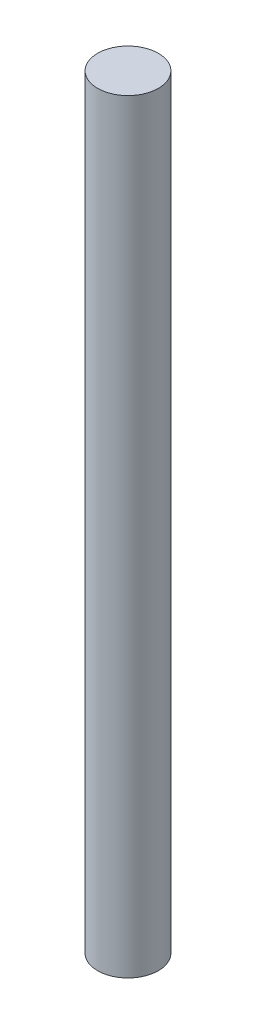
ISO-10303-21;
HEADER;
FILE_DESCRIPTION(('STEP AP214'),'2;1');
FILE_NAME('part.step','',(''),(''),'','','');
FILE_SCHEMA(('AUTOMOTIVE_DESIGN { 1 0 10303 214 1 1 1 1 }'));
ENDSEC;
DATA;
#1=APPLICATION_CONTEXT('core data for automotive mechanical design processes');
#2=APPLICATION_PROTOCOL_DEFINITION('international standard','automotive_design',2000,#1);
#3=PRODUCT_CONTEXT('',#1,'mechanical');
#4=PRODUCT('Part','Part','',(#3));
#5=PRODUCT_RELATED_PRODUCT_CATEGORY('part','',(#4));
#6=PRODUCT_DEFINITION_FORMATION('','',#4);
#7=PRODUCT_DEFINITION_CONTEXT('part definition',#1,'design');
#8=PRODUCT_DEFINITION('design','',#6,#7);
#9=PRODUCT_DEFINITION_SHAPE('','',#8);
#10=(LENGTH_UNIT() NAMED_UNIT(*) SI_UNIT(.MILLI.,.METRE.));
#11=(NAMED_UNIT(*) PLANE_ANGLE_UNIT() SI_UNIT($,.RADIAN.));
#12=(NAMED_UNIT(*) SI_UNIT($,.STERADIAN.) SOLID_ANGLE_UNIT());
#13=UNCERTAINTY_MEASURE_WITH_UNIT(LENGTH_MEASURE(1.E-05),#10,'distance_accuracy_value','');
#14=(GEOMETRIC_REPRESENTATION_CONTEXT(3) GLOBAL_UNCERTAINTY_ASSIGNED_CONTEXT((#13)) GLOBAL_UNIT_ASSIGNED_CONTEXT((#10,
#11,#12)) REPRESENTATION_CONTEXT('',''));
#15=CARTESIAN_POINT('',(0.,0.,0.));
#16=DIRECTION('',(0.,0.,1.));
#17=DIRECTION('',(1.,0.,0.));
#18=AXIS2_PLACEMENT_3D('',#15,#16,#17);
#19=CARTESIAN_POINT('',(0.,62.9,0.456480484606941));
#20=DIRECTION('',(0.,-1.,0.));
#21=DIRECTION('',(0.,0.,-1.));
#22=AXIS2_PLACEMENT_3D('',#19,#20,#21);
#23=CYLINDRICAL_SURFACE('',#22,2.5);
#24=CARTESIAN_POINT('',(0.,62.9,0.456480484606941));
#25=DIRECTION('',(0.,1.,0.));
#26=DIRECTION('',(0.,0.,1.));
#27=AXIS2_PLACEMENT_3D('',#24,#25,#26);
#28=CIRCLE('',#27,2.5);
#29=CARTESIAN_POINT('',(0.,62.9,2.95648048460694));
#30=VERTEX_POINT('',#29);
#31=EDGE_CURVE('E10',#30,#30,#28,.T.);
#32=ORIENTED_EDGE('',*,*,#31,.F.);
#33=EDGE_LOOP('',(#32));
#34=FACE_BOUND('',#33,.T.);
#35=CARTESIAN_POINT('',(0.,0.,0.456480484606941));
#36=DIRECTION('',(0.,1.,0.));
#37=DIRECTION('',(0.,0.,1.));
#38=AXIS2_PLACEMENT_3D('',#35,#36,#37);
#39=CIRCLE('',#38,2.5);
#40=CARTESIAN_POINT('',(0.,0.,2.95648048460694));
#41=VERTEX_POINT('',#40);
#42=EDGE_CURVE('E40',#41,#41,#39,.T.);
#43=ORIENTED_EDGE('',*,*,#42,.T.);
#44=EDGE_LOOP('',(#43));
#45=FACE_BOUND('',#44,.T.);
#46=ADVANCED_FACE('F37',(#34,#45),#23,.T.);
#47=CARTESIAN_POINT('',(0.,62.9,0.456480484606941));
#48=DIRECTION('',(0.,1.,0.));
#49=DIRECTION('',(0.,0.,1.));
#50=AXIS2_PLACEMENT_3D('',#47,#48,#49);
#51=PLANE('',#50);
#52=ORIENTED_EDGE('',*,*,#31,.T.);
#53=EDGE_LOOP('',(#52));
#54=FACE_BOUND('',#53,.T.);
#55=ADVANCED_FACE('F52',(#54),#51,.T.);
#56=CARTESIAN_POINT('',(0.,0.,0.456480484606941));
#57=DIRECTION('',(0.,1.,0.));
#58=DIRECTION('',(0.,0.,1.));
#59=AXIS2_PLACEMENT_3D('',#56,#57,#58);
#60=PLANE('',#59);
#61=ORIENTED_EDGE('',*,*,#42,.F.);
#62=EDGE_LOOP('',(#61));
#63=FACE_BOUND('',#62,.T.);
#64=ADVANCED_FACE('F50',(#63),#60,.F.);
#65=CLOSED_SHELL('',(#46,#55,#64));
#66=MANIFOLD_SOLID_BREP('B2',#65);
#67=ADVANCED_BREP_SHAPE_REPRESENTATION('',(#18,#66),#14);
#68=SHAPE_DEFINITION_REPRESENTATION(#9,#67);
ENDSEC;
END-ISO-10303-21;
